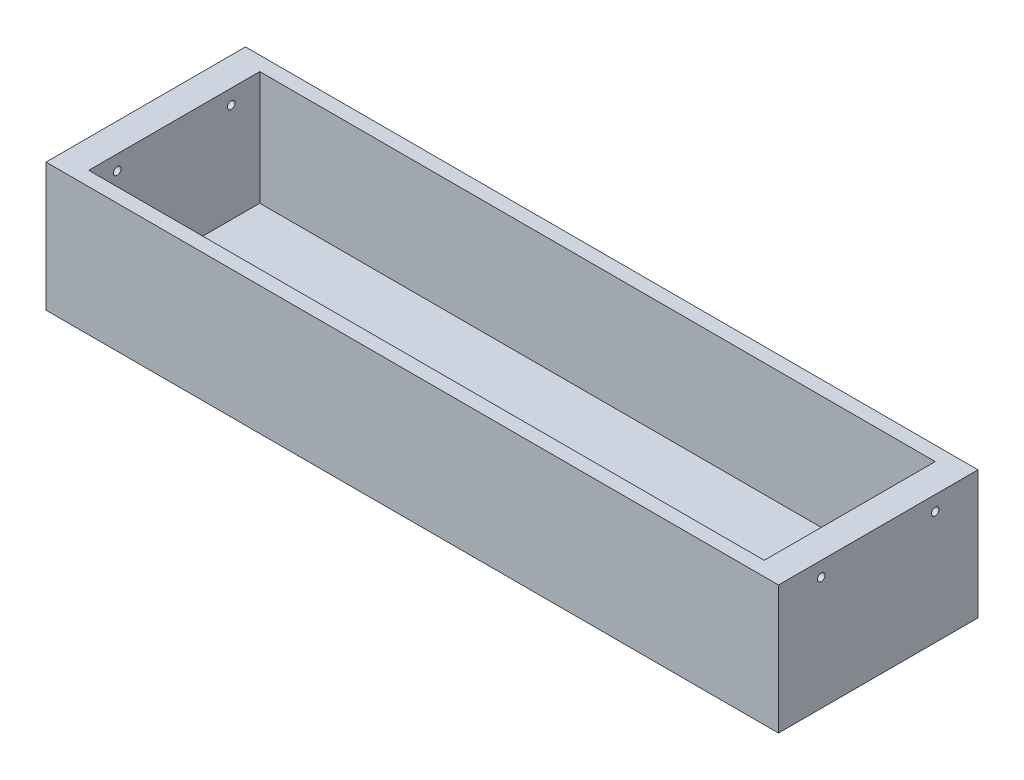
ISO-10303-21;
HEADER;
FILE_DESCRIPTION(('STEP AP214'),'2;1');
FILE_NAME('part.step','',(''),(''),'','','');
FILE_SCHEMA(('AUTOMOTIVE_DESIGN { 1 0 10303 214 1 1 1 1 }'));
ENDSEC;
DATA;
#1=APPLICATION_CONTEXT('core data for automotive mechanical design processes');
#2=APPLICATION_PROTOCOL_DEFINITION('international standard','automotive_design',2000,#1);
#3=PRODUCT_CONTEXT('',#1,'mechanical');
#4=PRODUCT('Part','Part','',(#3));
#5=PRODUCT_RELATED_PRODUCT_CATEGORY('part','',(#4));
#6=PRODUCT_DEFINITION_FORMATION('','',#4);
#7=PRODUCT_DEFINITION_CONTEXT('part definition',#1,'design');
#8=PRODUCT_DEFINITION('design','',#6,#7);
#9=PRODUCT_DEFINITION_SHAPE('','',#8);
#10=(LENGTH_UNIT() NAMED_UNIT(*) SI_UNIT(.MILLI.,.METRE.));
#11=(NAMED_UNIT(*) PLANE_ANGLE_UNIT() SI_UNIT($,.RADIAN.));
#12=(NAMED_UNIT(*) SI_UNIT($,.STERADIAN.) SOLID_ANGLE_UNIT());
#13=UNCERTAINTY_MEASURE_WITH_UNIT(LENGTH_MEASURE(1.E-05),#10,'distance_accuracy_value','');
#14=(GEOMETRIC_REPRESENTATION_CONTEXT(3) GLOBAL_UNCERTAINTY_ASSIGNED_CONTEXT((#13)) GLOBAL_UNIT_ASSIGNED_CONTEXT((#10,
#11,#12)) REPRESENTATION_CONTEXT('',''));
#15=CARTESIAN_POINT('',(0.,0.,0.));
#16=DIRECTION('',(0.,0.,1.));
#17=DIRECTION('',(1.,0.,0.));
#18=AXIS2_PLACEMENT_3D('',#15,#16,#17);
#19=CARTESIAN_POINT('',(0.,50.8,0.));
#20=DIRECTION('',(0.,-1.,0.));
#21=DIRECTION('',(0.,0.,-1.));
#22=AXIS2_PLACEMENT_3D('',#19,#20,#21);
#23=PLANE('',#22);
#24=DIRECTION('',(0.,0.,-1.));
#25=VECTOR('',#24,1.);
#26=CARTESIAN_POINT('',(163.195,50.8,44.45));
#27=LINE('',#26,#25);
#28=CARTESIAN_POINT('',(163.195,50.8,44.45));
#29=VERTEX_POINT('',#28);
#30=CARTESIAN_POINT('',(163.195,50.8,-44.45));
#31=VERTEX_POINT('',#30);
#32=EDGE_CURVE('E163',#29,#31,#27,.T.);
#33=ORIENTED_EDGE('',*,*,#32,.T.);
#34=DIRECTION('',(-1.,0.,0.));
#35=VECTOR('',#34,1.);
#36=CARTESIAN_POINT('',(-163.195,50.8,-44.45));
#37=LINE('',#36,#35);
#38=CARTESIAN_POINT('',(-163.195,50.8,-44.45));
#39=VERTEX_POINT('',#38);
#40=EDGE_CURVE('E112',#31,#39,#37,.T.);
#41=ORIENTED_EDGE('',*,*,#40,.T.);
#42=DIRECTION('',(0.,0.,1.));
#43=VECTOR('',#42,1.);
#44=CARTESIAN_POINT('',(-163.195,50.8,44.4500000000001));
#45=LINE('',#44,#43);
#46=CARTESIAN_POINT('',(-163.195,50.8,44.4500000000001));
#47=VERTEX_POINT('',#46);
#48=EDGE_CURVE('E166',#39,#47,#45,.T.);
#49=ORIENTED_EDGE('',*,*,#48,.T.);
#50=DIRECTION('',(1.,0.,0.));
#51=VECTOR('',#50,1.);
#52=CARTESIAN_POINT('',(-163.195,50.8,44.4500000000001));
#53=LINE('',#52,#51);
#54=EDGE_CURVE('E168',#47,#29,#53,.T.);
#55=ORIENTED_EDGE('',*,*,#54,.T.);
#56=EDGE_LOOP('',(#33,#41,#49,#55));
#57=FACE_BOUND('',#56,.T.);
#58=DIRECTION('',(0.,0.,-1.));
#59=VECTOR('',#58,1.);
#60=CARTESIAN_POINT('',(150.495,50.8,38.1));
#61=LINE('',#60,#59);
#62=CARTESIAN_POINT('',(150.495,50.8,38.1));
#63=VERTEX_POINT('',#62);
#64=CARTESIAN_POINT('',(150.495,50.8,-38.1));
#65=VERTEX_POINT('',#64);
#66=EDGE_CURVE('E138',#63,#65,#61,.T.);
#67=ORIENTED_EDGE('',*,*,#66,.F.);
#68=DIRECTION('',(1.,0.,0.));
#69=VECTOR('',#68,1.);
#70=CARTESIAN_POINT('',(-150.495,50.8,38.1));
#71=LINE('',#70,#69);
#72=CARTESIAN_POINT('',(-150.495,50.8,38.1));
#73=VERTEX_POINT('',#72);
#74=EDGE_CURVE('E145',#73,#63,#71,.T.);
#75=ORIENTED_EDGE('',*,*,#74,.F.);
#76=DIRECTION('',(0.,0.,1.));
#77=VECTOR('',#76,1.);
#78=CARTESIAN_POINT('',(-150.495,50.8,38.1));
#79=LINE('',#78,#77);
#80=CARTESIAN_POINT('',(-150.495,50.8,-38.0999999999999));
#81=VERTEX_POINT('',#80);
#82=EDGE_CURVE('E143',#81,#73,#79,.T.);
#83=ORIENTED_EDGE('',*,*,#82,.F.);
#84=DIRECTION('',(-1.,0.,0.));
#85=VECTOR('',#84,1.);
#86=CARTESIAN_POINT('',(-150.495,50.8,-38.0999999999999));
#87=LINE('',#86,#85);
#88=EDGE_CURVE('E140',#65,#81,#87,.T.);
#89=ORIENTED_EDGE('',*,*,#88,.F.);
#90=EDGE_LOOP('',(#67,#75,#83,#89));
#91=FACE_BOUND('',#90,.T.);
#92=ADVANCED_FACE('F39',(#57,#91),#23,.F.);
#93=CARTESIAN_POINT('',(163.195,50.8,44.45));
#94=DIRECTION('',(-1.,0.,0.));
#95=DIRECTION('',(0.,0.,1.));
#96=AXIS2_PLACEMENT_3D('',#93,#94,#95);
#97=PLANE('',#96);
#98=CARTESIAN_POINT('',(163.195,44.22394,-25.4));
#99=DIRECTION('',(1.,0.,0.));
#100=DIRECTION('',(0.,0.,-1.));
#101=AXIS2_PLACEMENT_3D('',#98,#99,#100);
#102=CIRCLE('',#101,1.6875);
#103=CARTESIAN_POINT('',(163.195,44.22394,-27.0875));
#104=VERTEX_POINT('',#103);
#105=EDGE_CURVE('E188',#104,#104,#102,.T.);
#106=ORIENTED_EDGE('',*,*,#105,.F.);
#107=EDGE_LOOP('',(#106));
#108=FACE_BOUND('',#107,.T.);
#109=CARTESIAN_POINT('',(163.195,44.22394,25.4));
#110=DIRECTION('',(1.,0.,0.));
#111=DIRECTION('',(0.,0.,1.));
#112=AXIS2_PLACEMENT_3D('',#109,#110,#111);
#113=CIRCLE('',#112,1.6875);
#114=CARTESIAN_POINT('',(163.195,44.22394,27.0875));
#115=VERTEX_POINT('',#114);
#116=EDGE_CURVE('E192',#115,#115,#113,.T.);
#117=ORIENTED_EDGE('',*,*,#116,.F.);
#118=EDGE_LOOP('',(#117));
#119=FACE_BOUND('',#118,.T.);
#120=DIRECTION('',(0.,-1.,0.));
#121=VECTOR('',#120,1.);
#122=CARTESIAN_POINT('',(163.195,50.8,44.45));
#123=LINE('',#122,#121);
#124=CARTESIAN_POINT('',(163.195,-6.35,44.45));
#125=VERTEX_POINT('',#124);
#126=EDGE_CURVE('E119',#29,#125,#123,.T.);
#127=ORIENTED_EDGE('',*,*,#126,.T.);
#128=DIRECTION('',(0.,0.,1.));
#129=VECTOR('',#128,1.);
#130=CARTESIAN_POINT('',(163.195,-6.35,-44.45));
#131=LINE('',#130,#129);
#132=CARTESIAN_POINT('',(163.195,-6.35,-44.45));
#133=VERTEX_POINT('',#132);
#134=EDGE_CURVE('E117',#133,#125,#131,.T.);
#135=ORIENTED_EDGE('',*,*,#134,.F.);
#136=DIRECTION('',(0.,-1.,0.));
#137=VECTOR('',#136,1.);
#138=CARTESIAN_POINT('',(163.195,50.8,-44.45));
#139=LINE('',#138,#137);
#140=EDGE_CURVE('E11',#31,#133,#139,.T.);
#141=ORIENTED_EDGE('',*,*,#140,.F.);
#142=ORIENTED_EDGE('',*,*,#32,.F.);
#143=EDGE_LOOP('',(#127,#135,#141,#142));
#144=FACE_BOUND('',#143,.T.);
#145=ADVANCED_FACE('F41',(#108,#119,#144),#97,.F.);
#146=CARTESIAN_POINT('',(-163.195,50.8,-44.45));
#147=DIRECTION('',(0.,0.,1.));
#148=DIRECTION('',(1.,0.,0.));
#149=AXIS2_PLACEMENT_3D('',#146,#147,#148);
#150=PLANE('',#149);
#151=ORIENTED_EDGE('',*,*,#140,.T.);
#152=DIRECTION('',(1.,0.,0.));
#153=VECTOR('',#152,1.);
#154=CARTESIAN_POINT('',(-163.195,-6.35,-44.45));
#155=LINE('',#154,#153);
#156=CARTESIAN_POINT('',(-163.195,-6.35,-44.45));
#157=VERTEX_POINT('',#156);
#158=EDGE_CURVE('E111',#157,#133,#155,.T.);
#159=ORIENTED_EDGE('',*,*,#158,.F.);
#160=DIRECTION('',(0.,-1.,0.));
#161=VECTOR('',#160,1.);
#162=CARTESIAN_POINT('',(-163.195,50.8,-44.45));
#163=LINE('',#162,#161);
#164=EDGE_CURVE('E48',#39,#157,#163,.T.);
#165=ORIENTED_EDGE('',*,*,#164,.F.);
#166=ORIENTED_EDGE('',*,*,#40,.F.);
#167=EDGE_LOOP('',(#151,#159,#165,#166));
#168=FACE_BOUND('',#167,.T.);
#169=ADVANCED_FACE('F108',(#168),#150,.F.);
#170=CARTESIAN_POINT('',(-163.195,50.8,44.4500000000001));
#171=DIRECTION('',(1.,0.,0.));
#172=DIRECTION('',(0.,0.,-1.));
#173=AXIS2_PLACEMENT_3D('',#170,#171,#172);
#174=PLANE('',#173);
#175=CARTESIAN_POINT('',(-163.195,44.22394,-25.4));
#176=DIRECTION('',(1.,0.,0.));
#177=DIRECTION('',(0.,0.,-1.));
#178=AXIS2_PLACEMENT_3D('',#175,#176,#177);
#179=CIRCLE('',#178,1.6875);
#180=CARTESIAN_POINT('',(-163.195,44.22394,-23.7125));
#181=VERTEX_POINT('',#180);
#182=EDGE_CURVE('E175',#181,#181,#179,.T.);
#183=ORIENTED_EDGE('',*,*,#182,.T.);
#184=EDGE_LOOP('',(#183));
#185=FACE_BOUND('',#184,.T.);
#186=CARTESIAN_POINT('',(-163.195,44.22394,25.4));
#187=DIRECTION('',(1.,0.,0.));
#188=DIRECTION('',(0.,0.,1.));
#189=AXIS2_PLACEMENT_3D('',#186,#187,#188);
#190=CIRCLE('',#189,1.6875);
#191=CARTESIAN_POINT('',(-163.195,44.22394,27.0875));
#192=VERTEX_POINT('',#191);
#193=EDGE_CURVE('E181',#192,#192,#190,.T.);
#194=ORIENTED_EDGE('',*,*,#193,.T.);
#195=EDGE_LOOP('',(#194));
#196=FACE_BOUND('',#195,.T.);
#197=ORIENTED_EDGE('',*,*,#164,.T.);
#198=DIRECTION('',(0.,0.,-1.));
#199=VECTOR('',#198,1.);
#200=CARTESIAN_POINT('',(-163.195,-6.35,44.4500000000001));
#201=LINE('',#200,#199);
#202=CARTESIAN_POINT('',(-163.195,-6.35,44.4500000000001));
#203=VERTEX_POINT('',#202);
#204=EDGE_CURVE('E128',#203,#157,#201,.T.);
#205=ORIENTED_EDGE('',*,*,#204,.F.);
#206=DIRECTION('',(0.,-1.,0.));
#207=VECTOR('',#206,1.);
#208=CARTESIAN_POINT('',(-163.195,50.8,44.4500000000001));
#209=LINE('',#208,#207);
#210=EDGE_CURVE('E171',#47,#203,#209,.T.);
#211=ORIENTED_EDGE('',*,*,#210,.F.);
#212=ORIENTED_EDGE('',*,*,#48,.F.);
#213=EDGE_LOOP('',(#197,#205,#211,#212));
#214=FACE_BOUND('',#213,.T.);
#215=ADVANCED_FACE('F240',(#185,#196,#214),#174,.F.);
#216=CARTESIAN_POINT('',(-163.195,50.8,44.4500000000001));
#217=DIRECTION('',(0.,0.,-1.));
#218=DIRECTION('',(-1.,0.,0.));
#219=AXIS2_PLACEMENT_3D('',#216,#217,#218);
#220=PLANE('',#219);
#221=ORIENTED_EDGE('',*,*,#210,.T.);
#222=DIRECTION('',(-1.,0.,0.));
#223=VECTOR('',#222,1.);
#224=CARTESIAN_POINT('',(163.195,-6.35,44.45));
#225=LINE('',#224,#223);
#226=EDGE_CURVE('E123',#125,#203,#225,.T.);
#227=ORIENTED_EDGE('',*,*,#226,.F.);
#228=ORIENTED_EDGE('',*,*,#126,.F.);
#229=ORIENTED_EDGE('',*,*,#54,.F.);
#230=EDGE_LOOP('',(#221,#227,#228,#229));
#231=FACE_BOUND('',#230,.T.);
#232=ADVANCED_FACE('F237',(#231),#220,.F.);
#233=CARTESIAN_POINT('',(150.495,50.8,38.1));
#234=DIRECTION('',(-1.,0.,0.));
#235=DIRECTION('',(0.,0.,1.));
#236=AXIS2_PLACEMENT_3D('',#233,#234,#235);
#237=PLANE('',#236);
#238=CARTESIAN_POINT('',(150.495,44.22394,-25.4));
#239=DIRECTION('',(-1.,0.,0.));
#240=DIRECTION('',(0.,0.,1.));
#241=AXIS2_PLACEMENT_3D('',#238,#239,#240);
#242=CIRCLE('',#241,1.6875);
#243=CARTESIAN_POINT('',(150.495,44.22394,-23.7125));
#244=VERTEX_POINT('',#243);
#245=EDGE_CURVE('E191',#244,#244,#242,.F.);
#246=ORIENTED_EDGE('',*,*,#245,.T.);
#247=EDGE_LOOP('',(#246));
#248=FACE_BOUND('',#247,.T.);
#249=CARTESIAN_POINT('',(150.495,44.22394,25.4));
#250=DIRECTION('',(-1.,0.,0.));
#251=DIRECTION('',(0.,0.,1.));
#252=AXIS2_PLACEMENT_3D('',#249,#250,#251);
#253=CIRCLE('',#252,1.6875);
#254=CARTESIAN_POINT('',(150.495,44.22394,27.0875));
#255=VERTEX_POINT('',#254);
#256=EDGE_CURVE('E179',#255,#255,#253,.F.);
#257=ORIENTED_EDGE('',*,*,#256,.T.);
#258=EDGE_LOOP('',(#257));
#259=FACE_BOUND('',#258,.T.);
#260=DIRECTION('',(0.,0.,-1.));
#261=VECTOR('',#260,1.);
#262=CARTESIAN_POINT('',(150.495,0.,38.1));
#263=LINE('',#262,#261);
#264=CARTESIAN_POINT('',(150.495,0.,38.1));
#265=VERTEX_POINT('',#264);
#266=CARTESIAN_POINT('',(150.495,0.,-38.1));
#267=VERTEX_POINT('',#266);
#268=EDGE_CURVE('E64',#265,#267,#263,.T.);
#269=ORIENTED_EDGE('',*,*,#268,.F.);
#270=DIRECTION('',(0.,-1.,0.));
#271=VECTOR('',#270,1.);
#272=CARTESIAN_POINT('',(150.495,50.8,38.1));
#273=LINE('',#272,#271);
#274=EDGE_CURVE('E147',#63,#265,#273,.T.);
#275=ORIENTED_EDGE('',*,*,#274,.F.);
#276=ORIENTED_EDGE('',*,*,#66,.T.);
#277=DIRECTION('',(0.,-1.,0.));
#278=VECTOR('',#277,1.);
#279=CARTESIAN_POINT('',(150.495,50.8,-38.1));
#280=LINE('',#279,#278);
#281=EDGE_CURVE('E161',#65,#267,#280,.T.);
#282=ORIENTED_EDGE('',*,*,#281,.T.);
#283=EDGE_LOOP('',(#269,#275,#276,#282));
#284=FACE_BOUND('',#283,.T.);
#285=ADVANCED_FACE('F235',(#248,#259,#284),#237,.T.);
#286=CARTESIAN_POINT('',(-150.495,50.8,-38.0999999999999));
#287=DIRECTION('',(0.,0.,1.));
#288=DIRECTION('',(1.,0.,0.));
#289=AXIS2_PLACEMENT_3D('',#286,#287,#288);
#290=PLANE('',#289);
#291=DIRECTION('',(-1.,0.,0.));
#292=VECTOR('',#291,1.);
#293=CARTESIAN_POINT('',(-150.495,0.,-38.0999999999999));
#294=LINE('',#293,#292);
#295=CARTESIAN_POINT('',(-150.495,0.,-38.0999999999999));
#296=VERTEX_POINT('',#295);
#297=EDGE_CURVE('E149',#267,#296,#294,.T.);
#298=ORIENTED_EDGE('',*,*,#297,.F.);
#299=ORIENTED_EDGE('',*,*,#281,.F.);
#300=ORIENTED_EDGE('',*,*,#88,.T.);
#301=DIRECTION('',(0.,-1.,0.));
#302=VECTOR('',#301,1.);
#303=CARTESIAN_POINT('',(-150.495,50.8,-38.0999999999999));
#304=LINE('',#303,#302);
#305=EDGE_CURVE('E159',#81,#296,#304,.T.);
#306=ORIENTED_EDGE('',*,*,#305,.T.);
#307=EDGE_LOOP('',(#298,#299,#300,#306));
#308=FACE_BOUND('',#307,.T.);
#309=ADVANCED_FACE('F257',(#308),#290,.T.);
#310=CARTESIAN_POINT('',(-150.495,50.8,38.1));
#311=DIRECTION('',(1.,0.,0.));
#312=DIRECTION('',(0.,0.,-1.));
#313=AXIS2_PLACEMENT_3D('',#310,#311,#312);
#314=PLANE('',#313);
#315=CARTESIAN_POINT('',(-150.495,44.22394,-25.4));
#316=DIRECTION('',(1.,0.,0.));
#317=DIRECTION('',(0.,0.,-1.));
#318=AXIS2_PLACEMENT_3D('',#315,#316,#317);
#319=CIRCLE('',#318,1.6875);
#320=CARTESIAN_POINT('',(-150.495,44.22394,-23.7125));
#321=VERTEX_POINT('',#320);
#322=EDGE_CURVE('E43',#321,#321,#319,.F.);
#323=ORIENTED_EDGE('',*,*,#322,.T.);
#324=EDGE_LOOP('',(#323));
#325=FACE_BOUND('',#324,.T.);
#326=CARTESIAN_POINT('',(-150.495,44.22394,25.4));
#327=DIRECTION('',(1.,0.,0.));
#328=DIRECTION('',(0.,0.,-1.));
#329=AXIS2_PLACEMENT_3D('',#326,#327,#328);
#330=CIRCLE('',#329,1.6875);
#331=CARTESIAN_POINT('',(-150.495,44.22394,27.0875));
#332=VERTEX_POINT('',#331);
#333=EDGE_CURVE('E173',#332,#332,#330,.F.);
#334=ORIENTED_EDGE('',*,*,#333,.T.);
#335=EDGE_LOOP('',(#334));
#336=FACE_BOUND('',#335,.T.);
#337=DIRECTION('',(0.,0.,1.));
#338=VECTOR('',#337,1.);
#339=CARTESIAN_POINT('',(-150.495,0.,38.1));
#340=LINE('',#339,#338);
#341=CARTESIAN_POINT('',(-150.495,0.,38.1));
#342=VERTEX_POINT('',#341);
#343=EDGE_CURVE('E152',#296,#342,#340,.T.);
#344=ORIENTED_EDGE('',*,*,#343,.F.);
#345=ORIENTED_EDGE('',*,*,#305,.F.);
#346=ORIENTED_EDGE('',*,*,#82,.T.);
#347=DIRECTION('',(0.,-1.,0.));
#348=VECTOR('',#347,1.);
#349=CARTESIAN_POINT('',(-150.495,50.8,38.1));
#350=LINE('',#349,#348);
#351=EDGE_CURVE('E56',#73,#342,#350,.T.);
#352=ORIENTED_EDGE('',*,*,#351,.T.);
#353=EDGE_LOOP('',(#344,#345,#346,#352));
#354=FACE_BOUND('',#353,.T.);
#355=ADVANCED_FACE('F261',(#325,#336,#354),#314,.T.);
#356=CARTESIAN_POINT('',(-150.495,50.8,38.1));
#357=DIRECTION('',(0.,0.,-1.));
#358=DIRECTION('',(-1.,0.,0.));
#359=AXIS2_PLACEMENT_3D('',#356,#357,#358);
#360=PLANE('',#359);
#361=DIRECTION('',(1.,0.,0.));
#362=VECTOR('',#361,1.);
#363=CARTESIAN_POINT('',(-150.495,0.,38.1));
#364=LINE('',#363,#362);
#365=EDGE_CURVE('E141',#342,#265,#364,.T.);
#366=ORIENTED_EDGE('',*,*,#365,.F.);
#367=ORIENTED_EDGE('',*,*,#351,.F.);
#368=ORIENTED_EDGE('',*,*,#74,.T.);
#369=ORIENTED_EDGE('',*,*,#274,.T.);
#370=EDGE_LOOP('',(#366,#367,#368,#369));
#371=FACE_BOUND('',#370,.T.);
#372=ADVANCED_FACE('F268',(#371),#360,.T.);
#373=CARTESIAN_POINT('',(0.,0.,0.));
#374=DIRECTION('',(0.,-1.,0.));
#375=DIRECTION('',(0.,0.,-1.));
#376=AXIS2_PLACEMENT_3D('',#373,#374,#375);
#377=PLANE('',#376);
#378=CARTESIAN_POINT('',(-106.,0.,7.49999999999999));
#379=DIRECTION('',(0.,-1.,0.));
#380=DIRECTION('',(0.,0.,-1.));
#381=AXIS2_PLACEMENT_3D('',#378,#379,#380);
#382=CIRCLE('',#381,3.1);
#383=CARTESIAN_POINT('',(-106.,0.,4.39999999999999));
#384=VERTEX_POINT('',#383);
#385=EDGE_CURVE('E129',#384,#384,#382,.T.);
#386=ORIENTED_EDGE('',*,*,#385,.T.);
#387=EDGE_LOOP('',(#386));
#388=FACE_BOUND('',#387,.T.);
#389=CARTESIAN_POINT('',(-106.,0.,-7.49999999999999));
#390=DIRECTION('',(0.,-1.,0.));
#391=DIRECTION('',(0.,0.,-1.));
#392=AXIS2_PLACEMENT_3D('',#389,#390,#391);
#393=CIRCLE('',#392,3.1);
#394=CARTESIAN_POINT('',(-106.,0.,-10.6));
#395=VERTEX_POINT('',#394);
#396=EDGE_CURVE('E132',#395,#395,#393,.T.);
#397=ORIENTED_EDGE('',*,*,#396,.T.);
#398=EDGE_LOOP('',(#397));
#399=FACE_BOUND('',#398,.T.);
#400=ORIENTED_EDGE('',*,*,#343,.T.);
#401=ORIENTED_EDGE('',*,*,#365,.T.);
#402=ORIENTED_EDGE('',*,*,#268,.T.);
#403=ORIENTED_EDGE('',*,*,#297,.T.);
#404=EDGE_LOOP('',(#400,#401,#402,#403));
#405=FACE_BOUND('',#404,.T.);
#406=ADVANCED_FACE('F207',(#388,#399,#405),#377,.F.);
#407=CARTESIAN_POINT('',(0.,-6.35,0.));
#408=DIRECTION('',(0.,-1.,0.));
#409=DIRECTION('',(0.,0.,-1.));
#410=AXIS2_PLACEMENT_3D('',#407,#408,#409);
#411=PLANE('',#410);
#412=CARTESIAN_POINT('',(-106.,-6.35,7.49999999999999));
#413=DIRECTION('',(0.,-1.,0.));
#414=DIRECTION('',(0.,0.,-1.));
#415=AXIS2_PLACEMENT_3D('',#412,#413,#414);
#416=CIRCLE('',#415,3.1);
#417=CARTESIAN_POINT('',(-106.,-6.35,4.39999999999999));
#418=VERTEX_POINT('',#417);
#419=EDGE_CURVE('E200',#418,#418,#416,.T.);
#420=ORIENTED_EDGE('',*,*,#419,.F.);
#421=EDGE_LOOP('',(#420));
#422=FACE_BOUND('',#421,.T.);
#423=CARTESIAN_POINT('',(-106.,-6.35,-7.49999999999999));
#424=DIRECTION('',(0.,-1.,0.));
#425=DIRECTION('',(0.,0.,1.));
#426=AXIS2_PLACEMENT_3D('',#423,#424,#425);
#427=CIRCLE('',#426,3.1);
#428=CARTESIAN_POINT('',(-106.,-6.35,-4.39999999999999));
#429=VERTEX_POINT('',#428);
#430=EDGE_CURVE('E195',#429,#429,#427,.T.);
#431=ORIENTED_EDGE('',*,*,#430,.F.);
#432=EDGE_LOOP('',(#431));
#433=FACE_BOUND('',#432,.T.);
#434=ORIENTED_EDGE('',*,*,#158,.T.);
#435=ORIENTED_EDGE('',*,*,#134,.T.);
#436=ORIENTED_EDGE('',*,*,#226,.T.);
#437=ORIENTED_EDGE('',*,*,#204,.T.);
#438=EDGE_LOOP('',(#434,#435,#436,#437));
#439=FACE_BOUND('',#438,.T.);
#440=ADVANCED_FACE('F126',(#422,#433,#439),#411,.T.);
#441=CARTESIAN_POINT('',(-106.,50.8,-7.49999999999999));
#442=DIRECTION('',(0.,-1.,0.));
#443=DIRECTION('',(0.,0.,-1.));
#444=AXIS2_PLACEMENT_3D('',#441,#442,#443);
#445=CYLINDRICAL_SURFACE('',#444,3.1);
#446=ORIENTED_EDGE('',*,*,#430,.T.);
#447=EDGE_LOOP('',(#446));
#448=FACE_BOUND('',#447,.T.);
#449=ORIENTED_EDGE('',*,*,#396,.F.);
#450=EDGE_LOOP('',(#449));
#451=FACE_BOUND('',#450,.T.);
#452=ADVANCED_FACE('F210',(#448,#451),#445,.F.);
#453=CARTESIAN_POINT('',(-106.,50.8,7.49999999999999));
#454=DIRECTION('',(0.,-1.,0.));
#455=DIRECTION('',(0.,0.,-1.));
#456=AXIS2_PLACEMENT_3D('',#453,#454,#455);
#457=CYLINDRICAL_SURFACE('',#456,3.1);
#458=ORIENTED_EDGE('',*,*,#419,.T.);
#459=EDGE_LOOP('',(#458));
#460=FACE_BOUND('',#459,.T.);
#461=ORIENTED_EDGE('',*,*,#385,.F.);
#462=EDGE_LOOP('',(#461));
#463=FACE_BOUND('',#462,.T.);
#464=ADVANCED_FACE('F212',(#460,#463),#457,.F.);
#465=CARTESIAN_POINT('',(145.722029226991,44.22394,25.4));
#466=DIRECTION('',(1.,0.,0.));
#467=DIRECTION('',(0.,0.,-1.));
#468=AXIS2_PLACEMENT_3D('',#465,#466,#467);
#469=CYLINDRICAL_SURFACE('',#468,1.6875);
#470=ORIENTED_EDGE('',*,*,#116,.T.);
#471=EDGE_LOOP('',(#470));
#472=FACE_BOUND('',#471,.T.);
#473=ORIENTED_EDGE('',*,*,#256,.F.);
#474=EDGE_LOOP('',(#473));
#475=FACE_BOUND('',#474,.T.);
#476=ADVANCED_FACE('F219',(#472,#475),#469,.F.);
#477=CARTESIAN_POINT('',(145.722029226991,44.22394,-25.4));
#478=DIRECTION('',(1.,0.,0.));
#479=DIRECTION('',(0.,0.,-1.));
#480=AXIS2_PLACEMENT_3D('',#477,#478,#479);
#481=CYLINDRICAL_SURFACE('',#480,1.6875);
#482=ORIENTED_EDGE('',*,*,#105,.T.);
#483=EDGE_LOOP('',(#482));
#484=FACE_BOUND('',#483,.T.);
#485=ORIENTED_EDGE('',*,*,#245,.F.);
#486=EDGE_LOOP('',(#485));
#487=FACE_BOUND('',#486,.T.);
#488=ADVANCED_FACE('F304',(#484,#487),#481,.F.);
#489=CARTESIAN_POINT('',(155.267970773009,44.22394,25.4));
#490=DIRECTION('',(-1.,0.,0.));
#491=DIRECTION('',(0.,0.,1.));
#492=AXIS2_PLACEMENT_3D('',#489,#490,#491);
#493=CYLINDRICAL_SURFACE('',#492,1.6875);
#494=CARTESIAN_POINT('',(-150.495,44.22394,27.0875));
#495=CARTESIAN_POINT('',(-150.627291666667,44.22394,27.0875));
#496=CARTESIAN_POINT('',(-150.759583333333,44.22394,27.0875));
#497=CARTESIAN_POINT('',(-151.024166666667,44.22394,27.0875));
#498=CARTESIAN_POINT('',(-151.156458333333,44.22394,27.0875));
#499=CARTESIAN_POINT('',(-151.421041666667,44.22394,27.0875));
#500=CARTESIAN_POINT('',(-151.553333333333,44.22394,27.0875));
#501=CARTESIAN_POINT('',(-151.817916666667,44.22394,27.0875));
#502=CARTESIAN_POINT('',(-151.950208333333,44.22394,27.0875));
#503=CARTESIAN_POINT('',(-152.214791666667,44.22394,27.0875));
#504=CARTESIAN_POINT('',(-152.347083333333,44.22394,27.0875));
#505=CARTESIAN_POINT('',(-152.611666666667,44.22394,27.0875));
#506=CARTESIAN_POINT('',(-152.743958333333,44.22394,27.0875));
#507=CARTESIAN_POINT('',(-153.008541666667,44.22394,27.0875));
#508=CARTESIAN_POINT('',(-153.140833333333,44.22394,27.0875));
#509=CARTESIAN_POINT('',(-153.405416666667,44.22394,27.0875));
#510=CARTESIAN_POINT('',(-153.537708333333,44.22394,27.0875));
#511=CARTESIAN_POINT('',(-153.802291666667,44.22394,27.0875));
#512=CARTESIAN_POINT('',(-153.934583333333,44.22394,27.0875));
#513=CARTESIAN_POINT('',(-154.199166666667,44.22394,27.0875));
#514=CARTESIAN_POINT('',(-154.331458333333,44.22394,27.0875));
#515=CARTESIAN_POINT('',(-154.596041666667,44.22394,27.0875));
#516=CARTESIAN_POINT('',(-154.728333333333,44.22394,27.0875));
#517=CARTESIAN_POINT('',(-154.992916666667,44.22394,27.0875));
#518=CARTESIAN_POINT('',(-155.125208333333,44.22394,27.0875));
#519=CARTESIAN_POINT('',(-155.389791666667,44.22394,27.0875));
#520=CARTESIAN_POINT('',(-155.522083333333,44.22394,27.0875));
#521=CARTESIAN_POINT('',(-155.786666666667,44.22394,27.0875));
#522=CARTESIAN_POINT('',(-155.918958333333,44.22394,27.0875));
#523=CARTESIAN_POINT('',(-156.183541666667,44.22394,27.0875));
#524=CARTESIAN_POINT('',(-156.315833333333,44.22394,27.0875));
#525=CARTESIAN_POINT('',(-156.580416666667,44.22394,27.0875));
#526=CARTESIAN_POINT('',(-156.712708333333,44.22394,27.0875));
#527=CARTESIAN_POINT('',(-156.977291666667,44.22394,27.0875));
#528=CARTESIAN_POINT('',(-157.109583333333,44.22394,27.0875));
#529=CARTESIAN_POINT('',(-157.374166666667,44.22394,27.0875));
#530=CARTESIAN_POINT('',(-157.506458333333,44.22394,27.0875));
#531=CARTESIAN_POINT('',(-157.771041666667,44.22394,27.0875));
#532=CARTESIAN_POINT('',(-157.903333333333,44.22394,27.0875));
#533=CARTESIAN_POINT('',(-158.167916666667,44.22394,27.0875));
#534=CARTESIAN_POINT('',(-158.300208333333,44.22394,27.0875));
#535=CARTESIAN_POINT('',(-158.564791666667,44.22394,27.0875));
#536=CARTESIAN_POINT('',(-158.697083333333,44.22394,27.0875));
#537=CARTESIAN_POINT('',(-158.961666666667,44.22394,27.0875));
#538=CARTESIAN_POINT('',(-159.093958333333,44.22394,27.0875));
#539=CARTESIAN_POINT('',(-159.358541666667,44.22394,27.0875));
#540=CARTESIAN_POINT('',(-159.490833333333,44.22394,27.0875));
#541=CARTESIAN_POINT('',(-159.755416666667,44.22394,27.0875));
#542=CARTESIAN_POINT('',(-159.887708333333,44.22394,27.0875));
#543=CARTESIAN_POINT('',(-160.152291666667,44.22394,27.0875));
#544=CARTESIAN_POINT('',(-160.284583333333,44.22394,27.0875));
#545=CARTESIAN_POINT('',(-160.549166666667,44.22394,27.0875));
#546=CARTESIAN_POINT('',(-160.681458333333,44.22394,27.0875));
#547=CARTESIAN_POINT('',(-160.946041666667,44.22394,27.0875));
#548=CARTESIAN_POINT('',(-161.078333333333,44.22394,27.0875));
#549=CARTESIAN_POINT('',(-161.342916666667,44.22394,27.0875));
#550=CARTESIAN_POINT('',(-161.475208333333,44.22394,27.0875));
#551=CARTESIAN_POINT('',(-161.739791666667,44.22394,27.0875));
#552=CARTESIAN_POINT('',(-161.872083333333,44.22394,27.0875));
#553=CARTESIAN_POINT('',(-162.136666666667,44.22394,27.0875));
#554=CARTESIAN_POINT('',(-162.268958333333,44.22394,27.0875));
#555=CARTESIAN_POINT('',(-162.533541666667,44.22394,27.0875));
#556=CARTESIAN_POINT('',(-162.665833333333,44.22394,27.0875));
#557=CARTESIAN_POINT('',(-162.930416666667,44.22394,27.0875));
#558=CARTESIAN_POINT('',(-163.062708333333,44.22394,27.0875));
#559=CARTESIAN_POINT('',(-163.195,44.22394,27.0875));
#560=B_SPLINE_CURVE_WITH_KNOTS('',3,(#494,#495,#496,#497,#498,#499,#500,#501,#502,#503,#504,
#505,#506,#507,#508,#509,#510,#511,#512,#513,#514,#515,#516,#517,#518,#519,#520,#521,#522,#523,
#524,#525,#526,#527,#528,#529,#530,#531,#532,#533,#534,#535,#536,#537,#538,#539,#540,#541,#542,
#543,#544,#545,#546,#547,#548,#549,#550,#551,#552,#553,#554,#555,#556,#557,#558,#559),
.UNSPECIFIED.,.F.,.F.,(4,2,2,2,2,2,2,2,2,2,2,2,2,2,2,2,2,2,2,2,2,2,2,2,2,2,2,2,2,2,2,2,4),(0.,
0.396875000000019,0.793749999999982,1.190625,1.58749999999996,1.98437499999998,2.38125,
2.77812499999996,3.17499999999998,3.571875,3.96874999999997,4.36562499999998,4.7625,
5.15937499999997,5.55624999999998,5.95312499999995,6.34999999999997,6.74687499999999,
7.14374999999995,7.54062499999997,7.93749999999993,8.33437499999995,8.73124999999997,
9.12812499999993,9.52499999999995,9.92187499999997,10.3187499999999,10.715625,11.1125,
11.5093749999999,11.90625,12.3031249999999,12.6999999999999),.UNSPECIFIED.);
#561=EDGE_CURVE('BSEAM315',#332,#192,#560,.T.);
#562=ORIENTED_EDGE('',*,*,#333,.F.);
#563=ORIENTED_EDGE('',*,*,#193,.F.);
#564=ORIENTED_EDGE('',*,*,#561,.T.);
#565=ORIENTED_EDGE('',*,*,#561,.F.);
#566=EDGE_LOOP('',(#562,#564,#563,#565));
#567=FACE_BOUND('',#566,.T.);
#568=ADVANCED_FACE('F315',(#567),#493,.F.);
#569=CARTESIAN_POINT('',(155.267970773009,44.22394,-25.4));
#570=DIRECTION('',(-1.,0.,0.));
#571=DIRECTION('',(0.,0.,1.));
#572=AXIS2_PLACEMENT_3D('',#569,#570,#571);
#573=CYLINDRICAL_SURFACE('',#572,1.6875);
#574=CARTESIAN_POINT('',(-150.495,44.22394,-23.7125));
#575=CARTESIAN_POINT('',(-150.627291666667,44.22394,-23.7125));
#576=CARTESIAN_POINT('',(-150.759583333333,44.22394,-23.7125));
#577=CARTESIAN_POINT('',(-151.024166666667,44.22394,-23.7125));
#578=CARTESIAN_POINT('',(-151.156458333333,44.22394,-23.7125));
#579=CARTESIAN_POINT('',(-151.421041666667,44.22394,-23.7125));
#580=CARTESIAN_POINT('',(-151.553333333333,44.22394,-23.7125));
#581=CARTESIAN_POINT('',(-151.817916666667,44.22394,-23.7125));
#582=CARTESIAN_POINT('',(-151.950208333333,44.22394,-23.7125));
#583=CARTESIAN_POINT('',(-152.214791666667,44.22394,-23.7125));
#584=CARTESIAN_POINT('',(-152.347083333333,44.22394,-23.7125));
#585=CARTESIAN_POINT('',(-152.611666666667,44.22394,-23.7125));
#586=CARTESIAN_POINT('',(-152.743958333333,44.22394,-23.7125));
#587=CARTESIAN_POINT('',(-153.008541666667,44.22394,-23.7125));
#588=CARTESIAN_POINT('',(-153.140833333333,44.22394,-23.7125));
#589=CARTESIAN_POINT('',(-153.405416666667,44.22394,-23.7125));
#590=CARTESIAN_POINT('',(-153.537708333333,44.22394,-23.7125));
#591=CARTESIAN_POINT('',(-153.802291666667,44.22394,-23.7125));
#592=CARTESIAN_POINT('',(-153.934583333333,44.22394,-23.7125));
#593=CARTESIAN_POINT('',(-154.199166666667,44.22394,-23.7125));
#594=CARTESIAN_POINT('',(-154.331458333333,44.22394,-23.7125));
#595=CARTESIAN_POINT('',(-154.596041666667,44.22394,-23.7125));
#596=CARTESIAN_POINT('',(-154.728333333333,44.22394,-23.7125));
#597=CARTESIAN_POINT('',(-154.992916666667,44.22394,-23.7125));
#598=CARTESIAN_POINT('',(-155.125208333333,44.22394,-23.7125));
#599=CARTESIAN_POINT('',(-155.389791666667,44.22394,-23.7125));
#600=CARTESIAN_POINT('',(-155.522083333333,44.22394,-23.7125));
#601=CARTESIAN_POINT('',(-155.786666666667,44.22394,-23.7125));
#602=CARTESIAN_POINT('',(-155.918958333333,44.22394,-23.7125));
#603=CARTESIAN_POINT('',(-156.183541666667,44.22394,-23.7125));
#604=CARTESIAN_POINT('',(-156.315833333333,44.22394,-23.7125));
#605=CARTESIAN_POINT('',(-156.580416666667,44.22394,-23.7125));
#606=CARTESIAN_POINT('',(-156.712708333333,44.22394,-23.7125));
#607=CARTESIAN_POINT('',(-156.977291666667,44.22394,-23.7125));
#608=CARTESIAN_POINT('',(-157.109583333333,44.22394,-23.7125));
#609=CARTESIAN_POINT('',(-157.374166666667,44.22394,-23.7125));
#610=CARTESIAN_POINT('',(-157.506458333333,44.22394,-23.7125));
#611=CARTESIAN_POINT('',(-157.771041666667,44.22394,-23.7125));
#612=CARTESIAN_POINT('',(-157.903333333333,44.22394,-23.7125));
#613=CARTESIAN_POINT('',(-158.167916666667,44.22394,-23.7125));
#614=CARTESIAN_POINT('',(-158.300208333333,44.22394,-23.7125));
#615=CARTESIAN_POINT('',(-158.564791666667,44.22394,-23.7125));
#616=CARTESIAN_POINT('',(-158.697083333333,44.22394,-23.7125));
#617=CARTESIAN_POINT('',(-158.961666666667,44.22394,-23.7125));
#618=CARTESIAN_POINT('',(-159.093958333333,44.22394,-23.7125));
#619=CARTESIAN_POINT('',(-159.358541666667,44.22394,-23.7125));
#620=CARTESIAN_POINT('',(-159.490833333333,44.22394,-23.7125));
#621=CARTESIAN_POINT('',(-159.755416666667,44.22394,-23.7125));
#622=CARTESIAN_POINT('',(-159.887708333333,44.22394,-23.7125));
#623=CARTESIAN_POINT('',(-160.152291666667,44.22394,-23.7125));
#624=CARTESIAN_POINT('',(-160.284583333333,44.22394,-23.7125));
#625=CARTESIAN_POINT('',(-160.549166666667,44.22394,-23.7125));
#626=CARTESIAN_POINT('',(-160.681458333333,44.22394,-23.7125));
#627=CARTESIAN_POINT('',(-160.946041666667,44.22394,-23.7125));
#628=CARTESIAN_POINT('',(-161.078333333333,44.22394,-23.7125));
#629=CARTESIAN_POINT('',(-161.342916666667,44.22394,-23.7125));
#630=CARTESIAN_POINT('',(-161.475208333333,44.22394,-23.7125));
#631=CARTESIAN_POINT('',(-161.739791666667,44.22394,-23.7125));
#632=CARTESIAN_POINT('',(-161.872083333333,44.22394,-23.7125));
#633=CARTESIAN_POINT('',(-162.136666666667,44.22394,-23.7125));
#634=CARTESIAN_POINT('',(-162.268958333333,44.22394,-23.7125));
#635=CARTESIAN_POINT('',(-162.533541666667,44.22394,-23.7125));
#636=CARTESIAN_POINT('',(-162.665833333333,44.22394,-23.7125));
#637=CARTESIAN_POINT('',(-162.930416666667,44.22394,-23.7125));
#638=CARTESIAN_POINT('',(-163.062708333333,44.22394,-23.7125));
#639=CARTESIAN_POINT('',(-163.195,44.22394,-23.7125));
#640=B_SPLINE_CURVE_WITH_KNOTS('',3,(#574,#575,#576,#577,#578,#579,#580,#581,#582,#583,#584,
#585,#586,#587,#588,#589,#590,#591,#592,#593,#594,#595,#596,#597,#598,#599,#600,#601,#602,#603,
#604,#605,#606,#607,#608,#609,#610,#611,#612,#613,#614,#615,#616,#617,#618,#619,#620,#621,#622,
#623,#624,#625,#626,#627,#628,#629,#630,#631,#632,#633,#634,#635,#636,#637,#638,#639),
.UNSPECIFIED.,.F.,.F.,(4,2,2,2,2,2,2,2,2,2,2,2,2,2,2,2,2,2,2,2,2,2,2,2,2,2,2,2,2,2,2,2,4),(0.,
0.396875000000019,0.793749999999982,1.190625,1.58749999999996,1.98437499999998,2.38125,
2.77812499999996,3.17499999999998,3.571875,3.96874999999997,4.36562499999998,4.7625,
5.15937499999997,5.55624999999998,5.95312499999995,6.34999999999997,6.74687499999999,
7.14374999999995,7.54062499999997,7.93749999999993,8.33437499999995,8.73124999999997,
9.12812499999993,9.52499999999995,9.92187499999997,10.3187499999999,10.715625,11.1125,
11.5093749999999,11.90625,12.3031249999999,12.6999999999999),.UNSPECIFIED.);
#641=EDGE_CURVE('BSEAM325',#321,#181,#640,.T.);
#642=ORIENTED_EDGE('',*,*,#322,.F.);
#643=ORIENTED_EDGE('',*,*,#182,.F.);
#644=ORIENTED_EDGE('',*,*,#641,.T.);
#645=ORIENTED_EDGE('',*,*,#641,.F.);
#646=EDGE_LOOP('',(#642,#644,#643,#645));
#647=FACE_BOUND('',#646,.T.);
#648=ADVANCED_FACE('F325',(#647),#573,.F.);
#649=CLOSED_SHELL('',(#92,#145,#169,#215,#232,#285,#309,#355,#372,#406,#440,#452,#464,#476,#488,
#568,#648));
#650=MANIFOLD_SOLID_BREP('B2',#649);
#651=ADVANCED_BREP_SHAPE_REPRESENTATION('',(#18,#650),#14);
#652=SHAPE_DEFINITION_REPRESENTATION(#9,#651);
ENDSEC;
END-ISO-10303-21;
